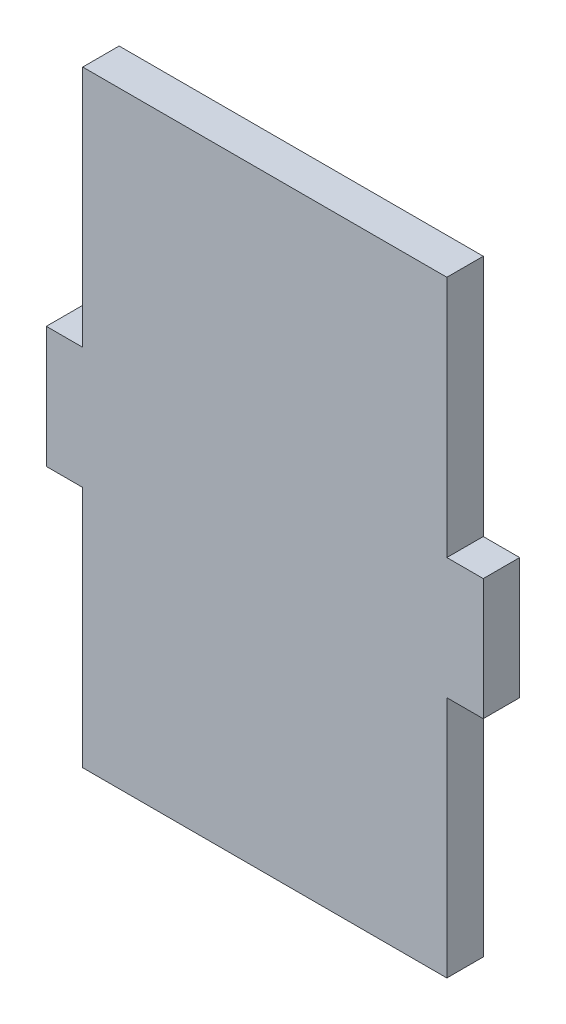
ISO-10303-21;
HEADER;
FILE_DESCRIPTION(('STEP AP214'),'2;1');
FILE_NAME('part.step','',(''),(''),'','','');
FILE_SCHEMA(('AUTOMOTIVE_DESIGN { 1 0 10303 214 1 1 1 1 }'));
ENDSEC;
DATA;
#1=APPLICATION_CONTEXT('core data for automotive mechanical design processes');
#2=APPLICATION_PROTOCOL_DEFINITION('international standard','automotive_design',2000,#1);
#3=PRODUCT_CONTEXT('',#1,'mechanical');
#4=PRODUCT('Part','Part','',(#3));
#5=PRODUCT_RELATED_PRODUCT_CATEGORY('part','',(#4));
#6=PRODUCT_DEFINITION_FORMATION('','',#4);
#7=PRODUCT_DEFINITION_CONTEXT('part definition',#1,'design');
#8=PRODUCT_DEFINITION('design','',#6,#7);
#9=PRODUCT_DEFINITION_SHAPE('','',#8);
#10=(LENGTH_UNIT() NAMED_UNIT(*) SI_UNIT(.MILLI.,.METRE.));
#11=(NAMED_UNIT(*) PLANE_ANGLE_UNIT() SI_UNIT($,.RADIAN.));
#12=(NAMED_UNIT(*) SI_UNIT($,.STERADIAN.) SOLID_ANGLE_UNIT());
#13=UNCERTAINTY_MEASURE_WITH_UNIT(LENGTH_MEASURE(1.E-05),#10,'distance_accuracy_value','');
#14=(GEOMETRIC_REPRESENTATION_CONTEXT(3) GLOBAL_UNCERTAINTY_ASSIGNED_CONTEXT((#13)) GLOBAL_UNIT_ASSIGNED_CONTEXT((#10,
#11,#12)) REPRESENTATION_CONTEXT('',''));
#15=CARTESIAN_POINT('',(0.,0.,0.));
#16=DIRECTION('',(0.,0.,1.));
#17=DIRECTION('',(1.,0.,0.));
#18=AXIS2_PLACEMENT_3D('',#15,#16,#17);
#19=CARTESIAN_POINT('',(-15.,5.00000000000001,3.));
#20=DIRECTION('',(1.,0.,0.));
#21=DIRECTION('',(0.,0.,-1.));
#22=AXIS2_PLACEMENT_3D('',#19,#20,#21);
#23=PLANE('',#22);
#24=DIRECTION('',(0.,-1.,0.));
#25=VECTOR('',#24,1.);
#26=CARTESIAN_POINT('',(-15.,5.00000000000001,0.));
#27=LINE('',#26,#25);
#28=CARTESIAN_POINT('',(-15.,25.,0.));
#29=VERTEX_POINT('',#28);
#30=CARTESIAN_POINT('',(-15.,5.00000000000001,0.));
#31=VERTEX_POINT('',#30);
#32=EDGE_CURVE('E164',#29,#31,#27,.T.);
#33=ORIENTED_EDGE('',*,*,#32,.T.);
#34=DIRECTION('',(0.,0.,-1.));
#35=VECTOR('',#34,1.);
#36=CARTESIAN_POINT('',(-15.,5.00000000000001,3.));
#37=LINE('',#36,#35);
#38=CARTESIAN_POINT('',(-15.,5.00000000000001,3.));
#39=VERTEX_POINT('',#38);
#40=EDGE_CURVE('E11',#39,#31,#37,.T.);
#41=ORIENTED_EDGE('',*,*,#40,.F.);
#42=DIRECTION('',(0.,-1.,0.));
#43=VECTOR('',#42,1.);
#44=CARTESIAN_POINT('',(-15.,5.00000000000001,3.));
#45=LINE('',#44,#43);
#46=CARTESIAN_POINT('',(-15.,25.,3.));
#47=VERTEX_POINT('',#46);
#48=EDGE_CURVE('E198',#47,#39,#45,.T.);
#49=ORIENTED_EDGE('',*,*,#48,.F.);
#50=DIRECTION('',(0.,0.,-1.));
#51=VECTOR('',#50,1.);
#52=CARTESIAN_POINT('',(-15.,25.,3.));
#53=LINE('',#52,#51);
#54=EDGE_CURVE('E160',#47,#29,#53,.T.);
#55=ORIENTED_EDGE('',*,*,#54,.T.);
#56=EDGE_LOOP('',(#33,#41,#49,#55));
#57=FACE_BOUND('',#56,.T.);
#58=ADVANCED_FACE('F39',(#57),#23,.F.);
#59=CARTESIAN_POINT('',(-18.,5.00000000000001,3.));
#60=DIRECTION('',(0.,-1.,0.));
#61=DIRECTION('',(1.,0.,0.));
#62=AXIS2_PLACEMENT_3D('',#59,#60,#61);
#63=PLANE('',#62);
#64=DIRECTION('',(-1.,0.,0.));
#65=VECTOR('',#64,1.);
#66=CARTESIAN_POINT('',(-18.,5.00000000000001,0.));
#67=LINE('',#66,#65);
#68=CARTESIAN_POINT('',(-18.,5.00000000000001,0.));
#69=VERTEX_POINT('',#68);
#70=EDGE_CURVE('E168',#31,#69,#67,.T.);
#71=ORIENTED_EDGE('',*,*,#70,.T.);
#72=DIRECTION('',(0.,0.,-1.));
#73=VECTOR('',#72,1.);
#74=CARTESIAN_POINT('',(-18.,5.00000000000001,3.));
#75=LINE('',#74,#73);
#76=CARTESIAN_POINT('',(-18.,5.00000000000001,3.));
#77=VERTEX_POINT('',#76);
#78=EDGE_CURVE('E48',#77,#69,#75,.T.);
#79=ORIENTED_EDGE('',*,*,#78,.F.);
#80=DIRECTION('',(-1.,0.,0.));
#81=VECTOR('',#80,1.);
#82=CARTESIAN_POINT('',(-18.,5.00000000000001,3.));
#83=LINE('',#82,#81);
#84=EDGE_CURVE('E111',#39,#77,#83,.T.);
#85=ORIENTED_EDGE('',*,*,#84,.F.);
#86=ORIENTED_EDGE('',*,*,#40,.T.);
#87=EDGE_LOOP('',(#71,#79,#85,#86));
#88=FACE_BOUND('',#87,.T.);
#89=ADVANCED_FACE('F292',(#88),#63,.F.);
#90=CARTESIAN_POINT('',(-18.,-4.99999999999999,3.));
#91=DIRECTION('',(1.,0.,0.));
#92=DIRECTION('',(0.,0.,-1.));
#93=AXIS2_PLACEMENT_3D('',#90,#91,#92);
#94=PLANE('',#93);
#95=DIRECTION('',(0.,-1.,0.));
#96=VECTOR('',#95,1.);
#97=CARTESIAN_POINT('',(-18.,-4.99999999999999,0.));
#98=LINE('',#97,#96);
#99=CARTESIAN_POINT('',(-18.,-4.99999999999999,0.));
#100=VERTEX_POINT('',#99);
#101=EDGE_CURVE('E171',#69,#100,#98,.T.);
#102=ORIENTED_EDGE('',*,*,#101,.T.);
#103=DIRECTION('',(0.,0.,-1.));
#104=VECTOR('',#103,1.);
#105=CARTESIAN_POINT('',(-18.,-4.99999999999999,3.));
#106=LINE('',#105,#104);
#107=CARTESIAN_POINT('',(-18.,-4.99999999999999,3.));
#108=VERTEX_POINT('',#107);
#109=EDGE_CURVE('E225',#108,#100,#106,.T.);
#110=ORIENTED_EDGE('',*,*,#109,.F.);
#111=DIRECTION('',(0.,-1.,0.));
#112=VECTOR('',#111,1.);
#113=CARTESIAN_POINT('',(-18.,-4.99999999999999,3.));
#114=LINE('',#113,#112);
#115=EDGE_CURVE('E235',#77,#108,#114,.T.);
#116=ORIENTED_EDGE('',*,*,#115,.F.);
#117=ORIENTED_EDGE('',*,*,#78,.T.);
#118=EDGE_LOOP('',(#102,#110,#116,#117));
#119=FACE_BOUND('',#118,.T.);
#120=ADVANCED_FACE('F233',(#119),#94,.F.);
#121=CARTESIAN_POINT('',(-15.,-4.99999999999999,3.));
#122=DIRECTION('',(0.,1.,0.));
#123=DIRECTION('',(-1.,0.,0.));
#124=AXIS2_PLACEMENT_3D('',#121,#122,#123);
#125=PLANE('',#124);
#126=DIRECTION('',(1.,0.,0.));
#127=VECTOR('',#126,1.);
#128=CARTESIAN_POINT('',(-15.,-4.99999999999999,0.));
#129=LINE('',#128,#127);
#130=CARTESIAN_POINT('',(-15.,-4.99999999999999,0.));
#131=VERTEX_POINT('',#130);
#132=EDGE_CURVE('E174',#100,#131,#129,.T.);
#133=ORIENTED_EDGE('',*,*,#132,.T.);
#134=DIRECTION('',(0.,0.,-1.));
#135=VECTOR('',#134,1.);
#136=CARTESIAN_POINT('',(-15.,-4.99999999999999,3.));
#137=LINE('',#136,#135);
#138=CARTESIAN_POINT('',(-15.,-4.99999999999999,3.));
#139=VERTEX_POINT('',#138);
#140=EDGE_CURVE('E221',#139,#131,#137,.T.);
#141=ORIENTED_EDGE('',*,*,#140,.F.);
#142=DIRECTION('',(1.,0.,0.));
#143=VECTOR('',#142,1.);
#144=CARTESIAN_POINT('',(-15.,-4.99999999999999,3.));
#145=LINE('',#144,#143);
#146=EDGE_CURVE('E254',#108,#139,#145,.T.);
#147=ORIENTED_EDGE('',*,*,#146,.F.);
#148=ORIENTED_EDGE('',*,*,#109,.T.);
#149=EDGE_LOOP('',(#133,#141,#147,#148));
#150=FACE_BOUND('',#149,.T.);
#151=ADVANCED_FACE('F244',(#150),#125,.F.);
#152=CARTESIAN_POINT('',(-15.,-25.,3.));
#153=DIRECTION('',(1.,0.,0.));
#154=DIRECTION('',(0.,0.,-1.));
#155=AXIS2_PLACEMENT_3D('',#152,#153,#154);
#156=PLANE('',#155);
#157=DIRECTION('',(0.,-1.,0.));
#158=VECTOR('',#157,1.);
#159=CARTESIAN_POINT('',(-15.,-25.,0.));
#160=LINE('',#159,#158);
#161=CARTESIAN_POINT('',(-15.,-25.,0.));
#162=VERTEX_POINT('',#161);
#163=EDGE_CURVE('E177',#131,#162,#160,.T.);
#164=ORIENTED_EDGE('',*,*,#163,.T.);
#165=DIRECTION('',(0.,0.,-1.));
#166=VECTOR('',#165,1.);
#167=CARTESIAN_POINT('',(-15.,-25.,3.));
#168=LINE('',#167,#166);
#169=CARTESIAN_POINT('',(-15.,-25.,3.));
#170=VERTEX_POINT('',#169);
#171=EDGE_CURVE('E217',#170,#162,#168,.T.);
#172=ORIENTED_EDGE('',*,*,#171,.F.);
#173=DIRECTION('',(0.,-1.,0.));
#174=VECTOR('',#173,1.);
#175=CARTESIAN_POINT('',(-15.,-25.,3.));
#176=LINE('',#175,#174);
#177=EDGE_CURVE('E250',#139,#170,#176,.T.);
#178=ORIENTED_EDGE('',*,*,#177,.F.);
#179=ORIENTED_EDGE('',*,*,#140,.T.);
#180=EDGE_LOOP('',(#164,#172,#178,#179));
#181=FACE_BOUND('',#180,.T.);
#182=ADVANCED_FACE('F248',(#181),#156,.F.);
#183=CARTESIAN_POINT('',(15.,-25.,3.));
#184=DIRECTION('',(0.,1.,0.));
#185=DIRECTION('',(-1.,0.,0.));
#186=AXIS2_PLACEMENT_3D('',#183,#184,#185);
#187=PLANE('',#186);
#188=DIRECTION('',(1.,0.,0.));
#189=VECTOR('',#188,1.);
#190=CARTESIAN_POINT('',(15.,-25.,0.));
#191=LINE('',#190,#189);
#192=CARTESIAN_POINT('',(15.,-25.,0.));
#193=VERTEX_POINT('',#192);
#194=EDGE_CURVE('E180',#162,#193,#191,.T.);
#195=ORIENTED_EDGE('',*,*,#194,.T.);
#196=DIRECTION('',(0.,0.,-1.));
#197=VECTOR('',#196,1.);
#198=CARTESIAN_POINT('',(15.,-25.,3.));
#199=LINE('',#198,#197);
#200=CARTESIAN_POINT('',(15.,-25.,3.));
#201=VERTEX_POINT('',#200);
#202=EDGE_CURVE('E213',#201,#193,#199,.T.);
#203=ORIENTED_EDGE('',*,*,#202,.F.);
#204=DIRECTION('',(1.,0.,0.));
#205=VECTOR('',#204,1.);
#206=CARTESIAN_POINT('',(15.,-25.,3.));
#207=LINE('',#206,#205);
#208=EDGE_CURVE('E253',#170,#201,#207,.T.);
#209=ORIENTED_EDGE('',*,*,#208,.F.);
#210=ORIENTED_EDGE('',*,*,#171,.T.);
#211=EDGE_LOOP('',(#195,#203,#209,#210));
#212=FACE_BOUND('',#211,.T.);
#213=ADVANCED_FACE('F305',(#212),#187,.F.);
#214=CARTESIAN_POINT('',(15.,-25.,3.));
#215=DIRECTION('',(-1.,0.,0.));
#216=DIRECTION('',(0.,0.,1.));
#217=AXIS2_PLACEMENT_3D('',#214,#215,#216);
#218=PLANE('',#217);
#219=DIRECTION('',(0.,1.,0.));
#220=VECTOR('',#219,1.);
#221=CARTESIAN_POINT('',(15.,-25.,0.));
#222=LINE('',#221,#220);
#223=CARTESIAN_POINT('',(15.,-4.99999999999999,0.));
#224=VERTEX_POINT('',#223);
#225=EDGE_CURVE('E183',#193,#224,#222,.T.);
#226=ORIENTED_EDGE('',*,*,#225,.T.);
#227=DIRECTION('',(0.,0.,-1.));
#228=VECTOR('',#227,1.);
#229=CARTESIAN_POINT('',(15.,-4.99999999999999,3.));
#230=LINE('',#229,#228);
#231=CARTESIAN_POINT('',(15.,-4.99999999999999,3.));
#232=VERTEX_POINT('',#231);
#233=EDGE_CURVE('E209',#232,#224,#230,.T.);
#234=ORIENTED_EDGE('',*,*,#233,.F.);
#235=DIRECTION('',(0.,1.,0.));
#236=VECTOR('',#235,1.);
#237=CARTESIAN_POINT('',(15.,-25.,3.));
#238=LINE('',#237,#236);
#239=EDGE_CURVE('E258',#201,#232,#238,.T.);
#240=ORIENTED_EDGE('',*,*,#239,.F.);
#241=ORIENTED_EDGE('',*,*,#202,.T.);
#242=EDGE_LOOP('',(#226,#234,#240,#241));
#243=FACE_BOUND('',#242,.T.);
#244=ADVANCED_FACE('F308',(#243),#218,.F.);
#245=CARTESIAN_POINT('',(18.,-4.99999999999999,3.));
#246=DIRECTION('',(0.,1.,0.));
#247=DIRECTION('',(0.,0.,1.));
#248=AXIS2_PLACEMENT_3D('',#245,#246,#247);
#249=PLANE('',#248);
#250=DIRECTION('',(1.,0.,0.));
#251=VECTOR('',#250,1.);
#252=CARTESIAN_POINT('',(18.,-4.99999999999999,0.));
#253=LINE('',#252,#251);
#254=CARTESIAN_POINT('',(18.,-4.99999999999999,0.));
#255=VERTEX_POINT('',#254);
#256=EDGE_CURVE('E186',#224,#255,#253,.T.);
#257=ORIENTED_EDGE('',*,*,#256,.T.);
#258=DIRECTION('',(0.,0.,-1.));
#259=VECTOR('',#258,1.);
#260=CARTESIAN_POINT('',(18.,-4.99999999999999,3.));
#261=LINE('',#260,#259);
#262=CARTESIAN_POINT('',(18.,-4.99999999999999,3.));
#263=VERTEX_POINT('',#262);
#264=EDGE_CURVE('E205',#263,#255,#261,.T.);
#265=ORIENTED_EDGE('',*,*,#264,.F.);
#266=DIRECTION('',(1.,0.,0.));
#267=VECTOR('',#266,1.);
#268=CARTESIAN_POINT('',(18.,-4.99999999999999,3.));
#269=LINE('',#268,#267);
#270=EDGE_CURVE('E265',#232,#263,#269,.T.);
#271=ORIENTED_EDGE('',*,*,#270,.F.);
#272=ORIENTED_EDGE('',*,*,#233,.T.);
#273=EDGE_LOOP('',(#257,#265,#271,#272));
#274=FACE_BOUND('',#273,.T.);
#275=ADVANCED_FACE('F273',(#274),#249,.F.);
#276=CARTESIAN_POINT('',(18.,5.00000000000001,3.));
#277=DIRECTION('',(-1.,0.,0.));
#278=DIRECTION('',(0.,-1.,0.));
#279=AXIS2_PLACEMENT_3D('',#276,#277,#278);
#280=PLANE('',#279);
#281=DIRECTION('',(0.,1.,0.));
#282=VECTOR('',#281,1.);
#283=CARTESIAN_POINT('',(18.,5.00000000000001,0.));
#284=LINE('',#283,#282);
#285=CARTESIAN_POINT('',(18.,5.00000000000001,0.));
#286=VERTEX_POINT('',#285);
#287=EDGE_CURVE('E189',#255,#286,#284,.T.);
#288=ORIENTED_EDGE('',*,*,#287,.T.);
#289=DIRECTION('',(0.,0.,-1.));
#290=VECTOR('',#289,1.);
#291=CARTESIAN_POINT('',(18.,5.00000000000001,3.));
#292=LINE('',#291,#290);
#293=CARTESIAN_POINT('',(18.,5.00000000000001,3.));
#294=VERTEX_POINT('',#293);
#295=EDGE_CURVE('E153',#294,#286,#292,.T.);
#296=ORIENTED_EDGE('',*,*,#295,.F.);
#297=DIRECTION('',(0.,1.,0.));
#298=VECTOR('',#297,1.);
#299=CARTESIAN_POINT('',(18.,5.00000000000001,3.));
#300=LINE('',#299,#298);
#301=EDGE_CURVE('E142',#263,#294,#300,.T.);
#302=ORIENTED_EDGE('',*,*,#301,.F.);
#303=ORIENTED_EDGE('',*,*,#264,.T.);
#304=EDGE_LOOP('',(#288,#296,#302,#303));
#305=FACE_BOUND('',#304,.T.);
#306=ADVANCED_FACE('F277',(#305),#280,.F.);
#307=CARTESIAN_POINT('',(15.,5.00000000000001,3.));
#308=DIRECTION('',(0.,-1.,0.));
#309=DIRECTION('',(1.,0.,0.));
#310=AXIS2_PLACEMENT_3D('',#307,#308,#309);
#311=PLANE('',#310);
#312=DIRECTION('',(-1.,0.,0.));
#313=VECTOR('',#312,1.);
#314=CARTESIAN_POINT('',(15.,5.00000000000001,0.));
#315=LINE('',#314,#313);
#316=CARTESIAN_POINT('',(15.,5.00000000000001,0.));
#317=VERTEX_POINT('',#316);
#318=EDGE_CURVE('E151',#286,#317,#315,.T.);
#319=ORIENTED_EDGE('',*,*,#318,.T.);
#320=DIRECTION('',(0.,0.,-1.));
#321=VECTOR('',#320,1.);
#322=CARTESIAN_POINT('',(15.,5.00000000000001,3.));
#323=LINE('',#322,#321);
#324=CARTESIAN_POINT('',(15.,5.00000000000001,3.));
#325=VERTEX_POINT('',#324);
#326=EDGE_CURVE('E148',#325,#317,#323,.T.);
#327=ORIENTED_EDGE('',*,*,#326,.F.);
#328=DIRECTION('',(-1.,0.,0.));
#329=VECTOR('',#328,1.);
#330=CARTESIAN_POINT('',(15.,5.00000000000001,3.));
#331=LINE('',#330,#329);
#332=EDGE_CURVE('E136',#294,#325,#331,.T.);
#333=ORIENTED_EDGE('',*,*,#332,.F.);
#334=ORIENTED_EDGE('',*,*,#295,.T.);
#335=EDGE_LOOP('',(#319,#327,#333,#334));
#336=FACE_BOUND('',#335,.T.);
#337=ADVANCED_FACE('F149',(#336),#311,.F.);
#338=CARTESIAN_POINT('',(15.,5.00000000000001,3.));
#339=DIRECTION('',(-1.,0.,0.));
#340=DIRECTION('',(0.,0.,1.));
#341=AXIS2_PLACEMENT_3D('',#338,#339,#340);
#342=PLANE('',#341);
#343=DIRECTION('',(0.,1.,0.));
#344=VECTOR('',#343,1.);
#345=CARTESIAN_POINT('',(15.,5.00000000000001,0.));
#346=LINE('',#345,#344);
#347=CARTESIAN_POINT('',(15.,25.,0.));
#348=VERTEX_POINT('',#347);
#349=EDGE_CURVE('E97',#317,#348,#346,.T.);
#350=ORIENTED_EDGE('',*,*,#349,.T.);
#351=DIRECTION('',(0.,0.,-1.));
#352=VECTOR('',#351,1.);
#353=CARTESIAN_POINT('',(15.,25.,3.));
#354=LINE('',#353,#352);
#355=CARTESIAN_POINT('',(15.,25.,3.));
#356=VERTEX_POINT('',#355);
#357=EDGE_CURVE('E154',#356,#348,#354,.T.);
#358=ORIENTED_EDGE('',*,*,#357,.F.);
#359=DIRECTION('',(0.,1.,0.));
#360=VECTOR('',#359,1.);
#361=CARTESIAN_POINT('',(15.,5.00000000000001,3.));
#362=LINE('',#361,#360);
#363=EDGE_CURVE('E140',#325,#356,#362,.T.);
#364=ORIENTED_EDGE('',*,*,#363,.F.);
#365=ORIENTED_EDGE('',*,*,#326,.T.);
#366=EDGE_LOOP('',(#350,#358,#364,#365));
#367=FACE_BOUND('',#366,.T.);
#368=ADVANCED_FACE('F156',(#367),#342,.F.);
#369=CARTESIAN_POINT('',(15.,25.,3.));
#370=DIRECTION('',(0.,-1.,0.));
#371=DIRECTION('',(0.,0.,-1.));
#372=AXIS2_PLACEMENT_3D('',#369,#370,#371);
#373=PLANE('',#372);
#374=DIRECTION('',(-1.,0.,0.));
#375=VECTOR('',#374,1.);
#376=CARTESIAN_POINT('',(15.,25.,0.));
#377=LINE('',#376,#375);
#378=EDGE_CURVE('E103',#348,#29,#377,.T.);
#379=ORIENTED_EDGE('',*,*,#378,.T.);
#380=ORIENTED_EDGE('',*,*,#54,.F.);
#381=DIRECTION('',(-1.,0.,0.));
#382=VECTOR('',#381,1.);
#383=CARTESIAN_POINT('',(15.,25.,3.));
#384=LINE('',#383,#382);
#385=EDGE_CURVE('E56',#356,#47,#384,.T.);
#386=ORIENTED_EDGE('',*,*,#385,.F.);
#387=ORIENTED_EDGE('',*,*,#357,.T.);
#388=EDGE_LOOP('',(#379,#380,#386,#387));
#389=FACE_BOUND('',#388,.T.);
#390=ADVANCED_FACE('F281',(#389),#373,.F.);
#391=CARTESIAN_POINT('',(0.,0.,3.));
#392=DIRECTION('',(0.,0.,1.));
#393=DIRECTION('',(1.,0.,0.));
#394=AXIS2_PLACEMENT_3D('',#391,#392,#393);
#395=PLANE('',#394);
#396=ORIENTED_EDGE('',*,*,#48,.T.);
#397=ORIENTED_EDGE('',*,*,#84,.T.);
#398=ORIENTED_EDGE('',*,*,#115,.T.);
#399=ORIENTED_EDGE('',*,*,#146,.T.);
#400=ORIENTED_EDGE('',*,*,#177,.T.);
#401=ORIENTED_EDGE('',*,*,#208,.T.);
#402=ORIENTED_EDGE('',*,*,#239,.T.);
#403=ORIENTED_EDGE('',*,*,#270,.T.);
#404=ORIENTED_EDGE('',*,*,#301,.T.);
#405=ORIENTED_EDGE('',*,*,#332,.T.);
#406=ORIENTED_EDGE('',*,*,#363,.T.);
#407=ORIENTED_EDGE('',*,*,#385,.T.);
#408=EDGE_LOOP('',(#396,#397,#398,#399,#400,#401,#402,#403,#404,#405,#406,#407));
#409=FACE_BOUND('',#408,.T.);
#410=ADVANCED_FACE('F138',(#409),#395,.T.);
#411=CARTESIAN_POINT('',(0.,0.,0.));
#412=DIRECTION('',(0.,0.,1.));
#413=DIRECTION('',(1.,0.,0.));
#414=AXIS2_PLACEMENT_3D('',#411,#412,#413);
#415=PLANE('',#414);
#416=ORIENTED_EDGE('',*,*,#32,.F.);
#417=ORIENTED_EDGE('',*,*,#378,.F.);
#418=ORIENTED_EDGE('',*,*,#349,.F.);
#419=ORIENTED_EDGE('',*,*,#318,.F.);
#420=ORIENTED_EDGE('',*,*,#287,.F.);
#421=ORIENTED_EDGE('',*,*,#256,.F.);
#422=ORIENTED_EDGE('',*,*,#225,.F.);
#423=ORIENTED_EDGE('',*,*,#194,.F.);
#424=ORIENTED_EDGE('',*,*,#163,.F.);
#425=ORIENTED_EDGE('',*,*,#132,.F.);
#426=ORIENTED_EDGE('',*,*,#101,.F.);
#427=ORIENTED_EDGE('',*,*,#70,.F.);
#428=EDGE_LOOP('',(#416,#417,#418,#419,#420,#421,#422,#423,#424,#425,#426,#427));
#429=FACE_BOUND('',#428,.T.);
#430=ADVANCED_FACE('F239',(#429),#415,.F.);
#431=CLOSED_SHELL('',(#58,#89,#120,#151,#182,#213,#244,#275,#306,#337,#368,#390,#410,#430));
#432=MANIFOLD_SOLID_BREP('B2',#431);
#433=ADVANCED_BREP_SHAPE_REPRESENTATION('',(#18,#432),#14);
#434=SHAPE_DEFINITION_REPRESENTATION(#9,#433);
ENDSEC;
END-ISO-10303-21;
